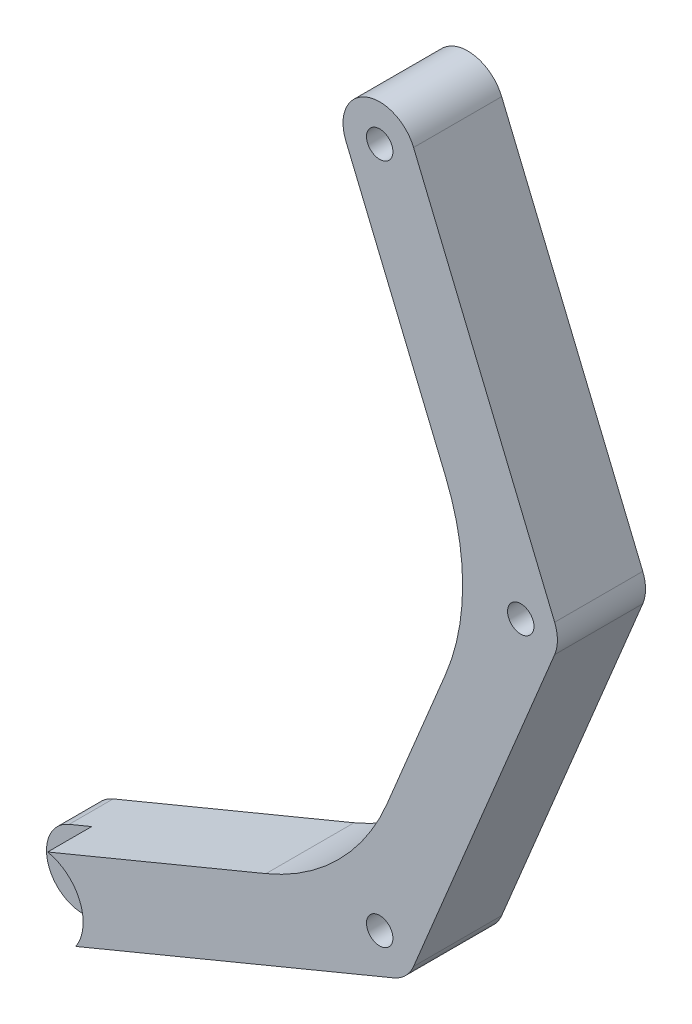
ISO-10303-21;
HEADER;
FILE_DESCRIPTION(('STEP AP214'),'2;1');
FILE_NAME('part.step','',(''),(''),'','','');
FILE_SCHEMA(('AUTOMOTIVE_DESIGN { 1 0 10303 214 1 1 1 1 }'));
ENDSEC;
DATA;
#1=APPLICATION_CONTEXT('core data for automotive mechanical design processes');
#2=APPLICATION_PROTOCOL_DEFINITION('international standard','automotive_design',2000,#1);
#3=PRODUCT_CONTEXT('',#1,'mechanical');
#4=PRODUCT('Part','Part','',(#3));
#5=PRODUCT_RELATED_PRODUCT_CATEGORY('part','',(#4));
#6=PRODUCT_DEFINITION_FORMATION('','',#4);
#7=PRODUCT_DEFINITION_CONTEXT('part definition',#1,'design');
#8=PRODUCT_DEFINITION('design','',#6,#7);
#9=PRODUCT_DEFINITION_SHAPE('','',#8);
#10=(LENGTH_UNIT() NAMED_UNIT(*) SI_UNIT(.MILLI.,.METRE.));
#11=(NAMED_UNIT(*) PLANE_ANGLE_UNIT() SI_UNIT($,.RADIAN.));
#12=(NAMED_UNIT(*) SI_UNIT($,.STERADIAN.) SOLID_ANGLE_UNIT());
#13=UNCERTAINTY_MEASURE_WITH_UNIT(LENGTH_MEASURE(1.E-05),#10,'distance_accuracy_value','');
#14=(GEOMETRIC_REPRESENTATION_CONTEXT(3) GLOBAL_UNCERTAINTY_ASSIGNED_CONTEXT((#13)) GLOBAL_UNIT_ASSIGNED_CONTEXT((#10,
#11,#12)) REPRESENTATION_CONTEXT('',''));
#15=CARTESIAN_POINT('',(0.,0.,0.));
#16=DIRECTION('',(0.,0.,1.));
#17=DIRECTION('',(1.,0.,0.));
#18=AXIS2_PLACEMENT_3D('',#15,#16,#17);
#19=CARTESIAN_POINT('',(3.17670914462147E-13,-27.3304030573829,5.));
#20=DIRECTION('',(0.,0.,-1.));
#21=DIRECTION('',(-1.,0.,0.));
#22=AXIS2_PLACEMENT_3D('',#19,#20,#21);
#23=CYLINDRICAL_SURFACE('',#22,2.08040305738294);
#24=CARTESIAN_POINT('',(3.17670914462147E-13,-27.3304030573829,2.5));
#25=DIRECTION('',(0.,0.,1.));
#26=DIRECTION('',(1.,0.,0.));
#27=AXIS2_PLACEMENT_3D('',#24,#25,#26);
#28=CIRCLE('',#27,2.08040305738294);
#29=CARTESIAN_POINT('',(-0.796135782701835,-25.4083612532929,2.5));
#30=VERTEX_POINT('',#29);
#31=CARTESIAN_POINT('',(0.796135782702469,-29.2524448614729,2.5));
#32=VERTEX_POINT('',#31);
#33=EDGE_CURVE('E285',#30,#32,#28,.T.);
#34=ORIENTED_EDGE('',*,*,#33,.F.);
#35=DIRECTION('',(0.,0.,-1.));
#36=VECTOR('',#35,1.);
#37=CARTESIAN_POINT('',(-0.796135782701835,-25.4083612532929,5.));
#38=LINE('',#37,#36);
#39=CARTESIAN_POINT('',(-0.796135782701835,-25.4083612532929,0.));
#40=VERTEX_POINT('',#39);
#41=EDGE_CURVE('E216',#30,#40,#38,.T.);
#42=ORIENTED_EDGE('',*,*,#41,.T.);
#43=CARTESIAN_POINT('',(3.17670914462147E-13,-27.3304030573829,0.));
#44=DIRECTION('',(0.,0.,1.));
#45=DIRECTION('',(1.,0.,0.));
#46=AXIS2_PLACEMENT_3D('',#43,#44,#45);
#47=CIRCLE('',#46,2.08040305738294);
#48=CARTESIAN_POINT('',(0.796135782702469,-29.2524448614729,0.));
#49=VERTEX_POINT('',#48);
#50=EDGE_CURVE('E198',#40,#49,#47,.T.);
#51=ORIENTED_EDGE('',*,*,#50,.T.);
#52=DIRECTION('',(0.,0.,-1.));
#53=VECTOR('',#52,1.);
#54=CARTESIAN_POINT('',(0.796135782702469,-29.2524448614729,5.));
#55=LINE('',#54,#53);
#56=EDGE_CURVE('E160',#32,#49,#55,.T.);
#57=ORIENTED_EDGE('',*,*,#56,.F.);
#58=EDGE_LOOP('',(#34,#42,#51,#57));
#59=FACE_BOUND('',#58,.T.);
#60=ADVANCED_FACE('F39',(#59),#23,.T.);
#61=CARTESIAN_POINT('',(27.3304030573829,3.15265643167592E-13,5.));
#62=DIRECTION('',(0.,0.,-1.));
#63=DIRECTION('',(-1.,0.,0.));
#64=AXIS2_PLACEMENT_3D('',#61,#62,#63);
#65=CYLINDRICAL_SURFACE('',#64,2.08040305738295);
#66=CARTESIAN_POINT('',(27.3304030573829,3.15265643167592E-13,0.));
#67=DIRECTION('',(0.,0.,1.));
#68=DIRECTION('',(1.,0.,0.));
#69=AXIS2_PLACEMENT_3D('',#66,#67,#68);
#70=CIRCLE('',#69,2.08040305738295);
#71=CARTESIAN_POINT('',(29.252444861473,-0.796135782701798,0.));
#72=VERTEX_POINT('',#71);
#73=CARTESIAN_POINT('',(29.2524448614729,0.796135782702469,0.));
#74=VERTEX_POINT('',#73);
#75=EDGE_CURVE('E171',#72,#74,#70,.T.);
#76=ORIENTED_EDGE('',*,*,#75,.T.);
#77=DIRECTION('',(0.,0.,-1.));
#78=VECTOR('',#77,1.);
#79=CARTESIAN_POINT('',(29.2524448614729,0.796135782702469,5.));
#80=LINE('',#79,#78);
#81=CARTESIAN_POINT('',(29.2524448614729,0.796135782702469,5.));
#82=VERTEX_POINT('',#81);
#83=EDGE_CURVE('E243',#82,#74,#80,.T.);
#84=ORIENTED_EDGE('',*,*,#83,.F.);
#85=CARTESIAN_POINT('',(27.3304030573829,3.15265643167592E-13,5.));
#86=DIRECTION('',(0.,0.,1.));
#87=DIRECTION('',(1.,0.,0.));
#88=AXIS2_PLACEMENT_3D('',#85,#86,#87);
#89=CIRCLE('',#88,2.08040305738295);
#90=CARTESIAN_POINT('',(29.252444861473,-0.796135782701798,5.));
#91=VERTEX_POINT('',#90);
#92=EDGE_CURVE('E209',#91,#82,#89,.T.);
#93=ORIENTED_EDGE('',*,*,#92,.F.);
#94=DIRECTION('',(0.,0.,-1.));
#95=VECTOR('',#94,1.);
#96=CARTESIAN_POINT('',(29.252444861473,-0.796135782701798,5.));
#97=LINE('',#96,#95);
#98=EDGE_CURVE('E167',#91,#72,#97,.T.);
#99=ORIENTED_EDGE('',*,*,#98,.T.);
#100=EDGE_LOOP('',(#76,#84,#93,#99));
#101=FACE_BOUND('',#100,.T.);
#102=ADVANCED_FACE('F41',(#101),#65,.T.);
#103=CARTESIAN_POINT('',(21.2475551385268,20.1216491171394,5.));
#104=DIRECTION('',(-0.923879532511282,-0.382683432365101,0.));
#105=DIRECTION('',(0.382683432365101,-0.923879532511282,0.));
#106=AXIS2_PLACEMENT_3D('',#103,#104,#105);
#107=PLANE('',#106);
#108=DIRECTION('',(-0.382683432365101,0.923879532511282,0.));
#109=VECTOR('',#108,1.);
#110=CARTESIAN_POINT('',(21.2475551385268,20.1216491171394,0.));
#111=LINE('',#110,#109);
#112=CARTESIAN_POINT('',(21.2475551385268,20.1216491171394,0.));
#113=VERTEX_POINT('',#112);
#114=EDGE_CURVE('E175',#74,#113,#111,.T.);
#115=ORIENTED_EDGE('',*,*,#114,.T.);
#116=DIRECTION('',(0.,0.,-1.));
#117=VECTOR('',#116,1.);
#118=CARTESIAN_POINT('',(21.2475551385268,20.1216491171394,5.));
#119=LINE('',#118,#117);
#120=CARTESIAN_POINT('',(21.2475551385268,20.1216491171394,5.));
#121=VERTEX_POINT('',#120);
#122=EDGE_CURVE('E239',#121,#113,#119,.T.);
#123=ORIENTED_EDGE('',*,*,#122,.F.);
#124=DIRECTION('',(-0.382683432365101,0.923879532511282,0.));
#125=VECTOR('',#124,1.);
#126=CARTESIAN_POINT('',(21.2475551385268,20.1216491171394,5.));
#127=LINE('',#126,#125);
#128=EDGE_CURVE('E120',#82,#121,#127,.T.);
#129=ORIENTED_EDGE('',*,*,#128,.F.);
#130=ORIENTED_EDGE('',*,*,#83,.T.);
#131=EDGE_LOOP('',(#115,#123,#129,#130));
#132=FACE_BOUND('',#131,.T.);
#133=ADVANCED_FACE('F344',(#132),#107,.F.);
#134=CARTESIAN_POINT('',(19.3255133344368,19.3255133344373,5.));
#135=DIRECTION('',(0.,0.,-1.));
#136=DIRECTION('',(-1.,0.,0.));
#137=AXIS2_PLACEMENT_3D('',#134,#135,#136);
#138=CYLINDRICAL_SURFACE('',#137,2.08040305738294);
#139=CARTESIAN_POINT('',(19.3255133344368,19.3255133344373,0.));
#140=DIRECTION('',(0.,0.,1.));
#141=DIRECTION('',(1.,0.,0.));
#142=AXIS2_PLACEMENT_3D('',#139,#140,#141);
#143=CIRCLE('',#142,2.08040305738294);
#144=CARTESIAN_POINT('',(17.4034715303468,18.5293775517351,0.));
#145=VERTEX_POINT('',#144);
#146=EDGE_CURVE('E179',#113,#145,#143,.T.);
#147=ORIENTED_EDGE('',*,*,#146,.T.);
#148=DIRECTION('',(0.,0.,-1.));
#149=VECTOR('',#148,1.);
#150=CARTESIAN_POINT('',(17.4034715303468,18.5293775517351,5.));
#151=LINE('',#150,#149);
#152=CARTESIAN_POINT('',(17.4034715303468,18.5293775517351,5.));
#153=VERTEX_POINT('',#152);
#154=EDGE_CURVE('E235',#153,#145,#151,.T.);
#155=ORIENTED_EDGE('',*,*,#154,.F.);
#156=CARTESIAN_POINT('',(19.3255133344368,19.3255133344373,5.));
#157=DIRECTION('',(0.,0.,1.));
#158=DIRECTION('',(1.,0.,0.));
#159=AXIS2_PLACEMENT_3D('',#156,#157,#158);
#160=CIRCLE('',#159,2.08040305738294);
#161=EDGE_CURVE('E296',#121,#153,#160,.T.);
#162=ORIENTED_EDGE('',*,*,#161,.F.);
#163=ORIENTED_EDGE('',*,*,#122,.T.);
#164=EDGE_LOOP('',(#147,#155,#162,#163));
#165=FACE_BOUND('',#164,.T.);
#166=ADVANCED_FACE('F347',(#165),#138,.T.);
#167=CARTESIAN_POINT('',(17.4034715303468,18.5293775517351,5.));
#168=DIRECTION('',(0.923879532511282,0.382683432365101,0.));
#169=DIRECTION('',(-0.382683432365101,0.923879532511282,0.));
#170=AXIS2_PLACEMENT_3D('',#167,#168,#169);
#171=PLANE('',#170);
#172=DIRECTION('',(0.382683432365101,-0.923879532511282,0.));
#173=VECTOR('',#172,1.);
#174=CARTESIAN_POINT('',(17.4034715303468,18.5293775517351,0.));
#175=LINE('',#174,#173);
#176=CARTESIAN_POINT('',(23.0654801337871,4.86007959103696,0.));
#177=VERTEX_POINT('',#176);
#178=EDGE_CURVE('E182',#145,#177,#175,.T.);
#179=ORIENTED_EDGE('',*,*,#178,.T.);
#180=DIRECTION('',(0.,0.,-1.));
#181=VECTOR('',#180,1.);
#182=CARTESIAN_POINT('',(23.0654801337871,4.86007959103696,5.));
#183=LINE('',#182,#181);
#184=CARTESIAN_POINT('',(23.0654801337871,4.86007959103696,5.));
#185=VERTEX_POINT('',#184);
#186=EDGE_CURVE('E231',#185,#177,#183,.T.);
#187=ORIENTED_EDGE('',*,*,#186,.F.);
#188=DIRECTION('',(0.382683432365101,-0.923879532511282,0.));
#189=VECTOR('',#188,1.);
#190=CARTESIAN_POINT('',(17.4034715303468,18.5293775517351,5.));
#191=LINE('',#190,#189);
#192=EDGE_CURVE('E299',#153,#185,#191,.T.);
#193=ORIENTED_EDGE('',*,*,#192,.F.);
#194=ORIENTED_EDGE('',*,*,#154,.T.);
#195=EDGE_LOOP('',(#179,#187,#193,#194));
#196=FACE_BOUND('',#195,.T.);
#197=ADVANCED_FACE('F352',(#196),#171,.F.);
#198=CARTESIAN_POINT('',(11.3322100708938,1.31912150161832E-13,5.));
#199=DIRECTION('',(0.,0.,-1.));
#200=DIRECTION('',(-1.,0.,0.));
#201=AXIS2_PLACEMENT_3D('',#198,#199,#200);
#202=CYLINDRICAL_SURFACE('',#201,12.7);
#203=CARTESIAN_POINT('',(11.3322100708938,1.31912150161832E-13,0.));
#204=DIRECTION('',(0.,0.,-1.));
#205=DIRECTION('',(-1.,0.,0.));
#206=AXIS2_PLACEMENT_3D('',#203,#204,#205);
#207=CIRCLE('',#206,12.7);
#208=CARTESIAN_POINT('',(23.0654801337872,-4.86007959103642,0.));
#209=VERTEX_POINT('',#208);
#210=EDGE_CURVE('E185',#177,#209,#207,.T.);
#211=ORIENTED_EDGE('',*,*,#210,.T.);
#212=DIRECTION('',(0.,0.,-1.));
#213=VECTOR('',#212,1.);
#214=CARTESIAN_POINT('',(23.0654801337872,-4.86007959103642,5.));
#215=LINE('',#214,#213);
#216=CARTESIAN_POINT('',(23.0654801337872,-4.86007959103642,5.));
#217=VERTEX_POINT('',#216);
#218=EDGE_CURVE('E227',#217,#209,#215,.T.);
#219=ORIENTED_EDGE('',*,*,#218,.F.);
#220=CARTESIAN_POINT('',(11.3322100708938,1.31912150161832E-13,5.));
#221=DIRECTION('',(0.,0.,-1.));
#222=DIRECTION('',(-1.,0.,0.));
#223=AXIS2_PLACEMENT_3D('',#220,#221,#222);
#224=CIRCLE('',#223,12.7);
#225=EDGE_CURVE('E302',#185,#217,#224,.T.);
#226=ORIENTED_EDGE('',*,*,#225,.F.);
#227=ORIENTED_EDGE('',*,*,#186,.T.);
#228=EDGE_LOOP('',(#211,#219,#226,#227));
#229=FACE_BOUND('',#228,.T.);
#230=ADVANCED_FACE('F358',(#229),#202,.F.);
#231=CARTESIAN_POINT('',(23.0654801337872,-4.86007959103642,5.));
#232=DIRECTION('',(0.923879532511291,-0.382683432365079,0.));
#233=DIRECTION('',(0.382683432365079,0.923879532511291,0.));
#234=AXIS2_PLACEMENT_3D('',#231,#232,#233);
#235=PLANE('',#234);
#236=DIRECTION('',(-0.382683432365079,-0.923879532511291,0.));
#237=VECTOR('',#236,1.);
#238=CARTESIAN_POINT('',(23.0654801337872,-4.86007959103642,0.));
#239=LINE('',#238,#237);
#240=CARTESIAN_POINT('',(19.746352649853,-12.8731621779959,0.));
#241=VERTEX_POINT('',#240);
#242=EDGE_CURVE('E188',#209,#241,#239,.T.);
#243=ORIENTED_EDGE('',*,*,#242,.T.);
#244=DIRECTION('',(0.,0.,-1.));
#245=VECTOR('',#244,1.);
#246=CARTESIAN_POINT('',(19.746352649853,-12.8731621779959,5.));
#247=LINE('',#246,#245);
#248=CARTESIAN_POINT('',(19.746352649853,-12.8731621779959,5.));
#249=VERTEX_POINT('',#248);
#250=EDGE_CURVE('E223',#249,#241,#247,.T.);
#251=ORIENTED_EDGE('',*,*,#250,.F.);
#252=DIRECTION('',(-0.382683432365079,-0.923879532511291,0.));
#253=VECTOR('',#252,1.);
#254=CARTESIAN_POINT('',(23.0654801337872,-4.86007959103642,5.));
#255=LINE('',#254,#253);
#256=EDGE_CURVE('E305',#217,#249,#255,.T.);
#257=ORIENTED_EDGE('',*,*,#256,.F.);
#258=ORIENTED_EDGE('',*,*,#218,.T.);
#259=EDGE_LOOP('',(#243,#251,#257,#258));
#260=FACE_BOUND('',#259,.T.);
#261=ADVANCED_FACE('F362',(#260),#235,.F.);
#262=CARTESIAN_POINT('',(8.01308258695958,-8.0130825869594,5.));
#263=DIRECTION('',(0.,0.,-1.));
#264=DIRECTION('',(-1.,0.,0.));
#265=AXIS2_PLACEMENT_3D('',#262,#263,#264);
#266=CYLINDRICAL_SURFACE('',#265,12.7);
#267=CARTESIAN_POINT('',(8.01308258695958,-8.0130825869594,0.));
#268=DIRECTION('',(0.,0.,-1.));
#269=DIRECTION('',(1.,0.,0.));
#270=AXIS2_PLACEMENT_3D('',#267,#268,#269);
#271=CIRCLE('',#270,12.7);
#272=CARTESIAN_POINT('',(12.8731621779963,-19.7463526498527,0.));
#273=VERTEX_POINT('',#272);
#274=EDGE_CURVE('E191',#241,#273,#271,.T.);
#275=ORIENTED_EDGE('',*,*,#274,.T.);
#276=DIRECTION('',(0.,0.,-1.));
#277=VECTOR('',#276,1.);
#278=CARTESIAN_POINT('',(12.8731621779963,-19.7463526498527,5.));
#279=LINE('',#278,#277);
#280=CARTESIAN_POINT('',(12.8731621779963,-19.7463526498527,5.));
#281=VERTEX_POINT('',#280);
#282=EDGE_CURVE('E219',#281,#273,#279,.T.);
#283=ORIENTED_EDGE('',*,*,#282,.F.);
#284=CARTESIAN_POINT('',(8.01308258695958,-8.0130825869594,5.));
#285=DIRECTION('',(0.,0.,-1.));
#286=DIRECTION('',(1.,0.,0.));
#287=AXIS2_PLACEMENT_3D('',#284,#285,#286);
#288=CIRCLE('',#287,12.7);
#289=EDGE_CURVE('E308',#249,#281,#288,.T.);
#290=ORIENTED_EDGE('',*,*,#289,.F.);
#291=ORIENTED_EDGE('',*,*,#250,.T.);
#292=EDGE_LOOP('',(#275,#283,#290,#291));
#293=FACE_BOUND('',#292,.T.);
#294=ADVANCED_FACE('F365',(#293),#266,.F.);
#295=CARTESIAN_POINT('',(-0.796135782701835,-25.4083612532929,5.));
#296=DIRECTION('',(0.3826834323651,-0.923879532511283,0.));
#297=DIRECTION('',(0.923879532511283,0.3826834323651,0.));
#298=AXIS2_PLACEMENT_3D('',#295,#296,#297);
#299=PLANE('',#298);
#300=DIRECTION('',(-0.923879532511283,-0.3826834323651,0.));
#301=VECTOR('',#300,1.);
#302=CARTESIAN_POINT('',(-0.796135782701835,-25.4083612532929,2.5));
#303=LINE('',#302,#301);
#304=CARTESIAN_POINT('',(0.484670211404371,-24.8778340397654,2.5));
#305=VERTEX_POINT('',#304);
#306=EDGE_CURVE('E176',#305,#30,#303,.T.);
#307=ORIENTED_EDGE('',*,*,#306,.F.);
#308=DIRECTION('',(0.,0.,1.));
#309=VECTOR('',#308,1.);
#310=CARTESIAN_POINT('',(0.484670211404372,-24.8778340397654,2.5));
#311=LINE('',#310,#309);
#312=CARTESIAN_POINT('',(0.484670211404371,-24.8778340397654,5.));
#313=VERTEX_POINT('',#312);
#314=EDGE_CURVE('E281',#305,#313,#311,.T.);
#315=ORIENTED_EDGE('',*,*,#314,.T.);
#316=DIRECTION('',(-0.923879532511282,-0.3826834323651,0.));
#317=VECTOR('',#316,1.);
#318=CARTESIAN_POINT('',(-0.796135782701835,-25.4083612532929,5.));
#319=LINE('',#318,#317);
#320=EDGE_CURVE('E150',#281,#313,#319,.T.);
#321=ORIENTED_EDGE('',*,*,#320,.F.);
#322=ORIENTED_EDGE('',*,*,#282,.T.);
#323=DIRECTION('',(-0.923879532511282,-0.3826834323651,0.));
#324=VECTOR('',#323,1.);
#325=CARTESIAN_POINT('',(-0.796135782701835,-25.4083612532929,0.));
#326=LINE('',#325,#324);
#327=EDGE_CURVE('E194',#273,#40,#326,.T.);
#328=ORIENTED_EDGE('',*,*,#327,.T.);
#329=ORIENTED_EDGE('',*,*,#41,.F.);
#330=EDGE_LOOP('',(#307,#315,#321,#322,#328,#329));
#331=FACE_BOUND('',#330,.T.);
#332=ADVANCED_FACE('F320',(#331),#299,.F.);
#333=CARTESIAN_POINT('',(0.796135782702469,-29.2524448614729,5.));
#334=DIRECTION('',(-0.3826834323651,0.923879532511283,0.));
#335=DIRECTION('',(-0.923879532511283,-0.3826834323651,0.));
#336=AXIS2_PLACEMENT_3D('',#333,#334,#335);
#337=PLANE('',#336);
#338=DIRECTION('',(0.923879532511283,0.3826834323651,0.));
#339=VECTOR('',#338,1.);
#340=CARTESIAN_POINT('',(0.796135782702469,-29.2524448614729,5.));
#341=LINE('',#340,#339);
#342=CARTESIAN_POINT('',(2.07694177680868,-28.7219176479454,5.));
#343=VERTEX_POINT('',#342);
#344=CARTESIAN_POINT('',(20.1216491171394,-21.2475551385268,5.));
#345=VERTEX_POINT('',#344);
#346=EDGE_CURVE('E141',#343,#345,#341,.T.);
#347=ORIENTED_EDGE('',*,*,#346,.F.);
#348=DIRECTION('',(0.,0.,1.));
#349=VECTOR('',#348,1.);
#350=CARTESIAN_POINT('',(2.07694177680868,-28.7219176479454,2.5));
#351=LINE('',#350,#349);
#352=CARTESIAN_POINT('',(2.07694177680868,-28.7219176479454,2.5));
#353=VERTEX_POINT('',#352);
#354=EDGE_CURVE('E57',#343,#353,#351,.F.);
#355=ORIENTED_EDGE('',*,*,#354,.T.);
#356=DIRECTION('',(0.923879532511283,0.3826834323651,0.));
#357=VECTOR('',#356,1.);
#358=CARTESIAN_POINT('',(0.796135782702469,-29.2524448614729,2.5));
#359=LINE('',#358,#357);
#360=EDGE_CURVE('E11',#32,#353,#359,.T.);
#361=ORIENTED_EDGE('',*,*,#360,.F.);
#362=ORIENTED_EDGE('',*,*,#56,.T.);
#363=DIRECTION('',(0.923879532511283,0.3826834323651,0.));
#364=VECTOR('',#363,1.);
#365=CARTESIAN_POINT('',(0.796135782702469,-29.2524448614729,0.));
#366=LINE('',#365,#364);
#367=CARTESIAN_POINT('',(20.1216491171394,-21.2475551385268,0.));
#368=VERTEX_POINT('',#367);
#369=EDGE_CURVE('E156',#49,#368,#366,.T.);
#370=ORIENTED_EDGE('',*,*,#369,.T.);
#371=DIRECTION('',(0.,0.,-1.));
#372=VECTOR('',#371,1.);
#373=CARTESIAN_POINT('',(20.1216491171394,-21.2475551385268,5.));
#374=LINE('',#373,#372);
#375=EDGE_CURVE('E153',#345,#368,#374,.T.);
#376=ORIENTED_EDGE('',*,*,#375,.F.);
#377=EDGE_LOOP('',(#347,#355,#361,#362,#370,#376));
#378=FACE_BOUND('',#377,.T.);
#379=ADVANCED_FACE('F154',(#378),#337,.F.);
#380=CARTESIAN_POINT('',(19.3255133344373,-19.3255133344368,5.));
#381=DIRECTION('',(0.,0.,-1.));
#382=DIRECTION('',(-1.,0.,0.));
#383=AXIS2_PLACEMENT_3D('',#380,#381,#382);
#384=CYLINDRICAL_SURFACE('',#383,2.08040305738295);
#385=CARTESIAN_POINT('',(19.3255133344373,-19.3255133344368,0.));
#386=DIRECTION('',(0.,0.,1.));
#387=DIRECTION('',(1.,0.,0.));
#388=AXIS2_PLACEMENT_3D('',#385,#386,#387);
#389=CIRCLE('',#388,2.08040305738295);
#390=CARTESIAN_POINT('',(21.2475551385273,-20.1216491171389,0.));
#391=VERTEX_POINT('',#390);
#392=EDGE_CURVE('E204',#368,#391,#389,.T.);
#393=ORIENTED_EDGE('',*,*,#392,.T.);
#394=DIRECTION('',(0.,0.,-1.));
#395=VECTOR('',#394,1.);
#396=CARTESIAN_POINT('',(21.2475551385273,-20.1216491171389,5.));
#397=LINE('',#396,#395);
#398=CARTESIAN_POINT('',(21.2475551385273,-20.1216491171389,5.));
#399=VERTEX_POINT('',#398);
#400=EDGE_CURVE('E161',#399,#391,#397,.T.);
#401=ORIENTED_EDGE('',*,*,#400,.F.);
#402=CARTESIAN_POINT('',(19.3255133344373,-19.3255133344368,5.));
#403=DIRECTION('',(0.,0.,1.));
#404=DIRECTION('',(1.,0.,0.));
#405=AXIS2_PLACEMENT_3D('',#402,#403,#404);
#406=CIRCLE('',#405,2.08040305738295);
#407=EDGE_CURVE('E145',#345,#399,#406,.T.);
#408=ORIENTED_EDGE('',*,*,#407,.F.);
#409=ORIENTED_EDGE('',*,*,#375,.T.);
#410=EDGE_LOOP('',(#393,#401,#408,#409));
#411=FACE_BOUND('',#410,.T.);
#412=ADVANCED_FACE('F163',(#411),#384,.T.);
#413=CARTESIAN_POINT('',(29.252444861473,-0.796135782701798,5.));
#414=DIRECTION('',(-0.923879532511291,0.382683432365079,0.));
#415=DIRECTION('',(-0.382683432365079,-0.923879532511291,0.));
#416=AXIS2_PLACEMENT_3D('',#413,#414,#415);
#417=PLANE('',#416);
#418=DIRECTION('',(0.382683432365079,0.923879532511291,0.));
#419=VECTOR('',#418,1.);
#420=CARTESIAN_POINT('',(29.252444861473,-0.796135782701798,0.));
#421=LINE('',#420,#419);
#422=EDGE_CURVE('E111',#391,#72,#421,.T.);
#423=ORIENTED_EDGE('',*,*,#422,.T.);
#424=ORIENTED_EDGE('',*,*,#98,.F.);
#425=DIRECTION('',(0.382683432365079,0.923879532511291,0.));
#426=VECTOR('',#425,1.);
#427=CARTESIAN_POINT('',(29.252444861473,-0.796135782701798,5.));
#428=LINE('',#427,#426);
#429=EDGE_CURVE('E66',#399,#91,#428,.T.);
#430=ORIENTED_EDGE('',*,*,#429,.F.);
#431=ORIENTED_EDGE('',*,*,#400,.T.);
#432=EDGE_LOOP('',(#423,#424,#430,#431));
#433=FACE_BOUND('',#432,.T.);
#434=ADVANCED_FACE('F338',(#433),#417,.F.);
#435=CARTESIAN_POINT('',(27.3304030573829,3.15265643167592E-13,5.));
#436=DIRECTION('',(0.,0.,1.));
#437=DIRECTION('',(1.,0.,0.));
#438=AXIS2_PLACEMENT_3D('',#435,#436,#437);
#439=PLANE('',#438);
#440=CARTESIAN_POINT('',(19.3255133344368,19.3255133344373,5.));
#441=DIRECTION('',(0.,0.,-1.));
#442=DIRECTION('',(-1.,0.,0.));
#443=AXIS2_PLACEMENT_3D('',#440,#441,#442);
#444=CIRCLE('',#443,0.750000000000002);
#445=CARTESIAN_POINT('',(18.5755133344368,19.3255133344373,5.));
#446=VERTEX_POINT('',#445);
#447=EDGE_CURVE('E258',#446,#446,#444,.T.);
#448=ORIENTED_EDGE('',*,*,#447,.T.);
#449=EDGE_LOOP('',(#448));
#450=FACE_BOUND('',#449,.T.);
#451=CARTESIAN_POINT('',(27.3304030573829,3.15265643167592E-13,5.));
#452=DIRECTION('',(0.,0.,-1.));
#453=DIRECTION('',(-1.,0.,0.));
#454=AXIS2_PLACEMENT_3D('',#451,#452,#453);
#455=CIRCLE('',#454,0.750000000000002);
#456=CARTESIAN_POINT('',(26.5804030573829,3.15265643167592E-13,5.));
#457=VERTEX_POINT('',#456);
#458=EDGE_CURVE('E417',#457,#457,#455,.T.);
#459=ORIENTED_EDGE('',*,*,#458,.T.);
#460=EDGE_LOOP('',(#459));
#461=FACE_BOUND('',#460,.T.);
#462=CARTESIAN_POINT('',(19.3255133344373,-19.3255133344368,5.));
#463=DIRECTION('',(0.,0.,-1.));
#464=DIRECTION('',(-1.,0.,0.));
#465=AXIS2_PLACEMENT_3D('',#462,#463,#464);
#466=CIRCLE('',#465,0.750000000000002);
#467=CARTESIAN_POINT('',(18.5755133344373,-19.3255133344368,5.));
#468=VERTEX_POINT('',#467);
#469=EDGE_CURVE('E274',#468,#468,#466,.T.);
#470=ORIENTED_EDGE('',*,*,#469,.T.);
#471=EDGE_LOOP('',(#470));
#472=FACE_BOUND('',#471,.T.);
#473=CARTESIAN_POINT('',(3.17670914462147E-13,-27.3304030573829,5.));
#474=DIRECTION('',(0.,0.,1.));
#475=DIRECTION('',(1.,0.,0.));
#476=AXIS2_PLACEMENT_3D('',#473,#474,#475);
#477=CIRCLE('',#476,2.5);
#478=EDGE_CURVE('E49',#343,#313,#477,.T.);
#479=ORIENTED_EDGE('',*,*,#478,.F.);
#480=ORIENTED_EDGE('',*,*,#346,.T.);
#481=ORIENTED_EDGE('',*,*,#407,.T.);
#482=ORIENTED_EDGE('',*,*,#429,.T.);
#483=ORIENTED_EDGE('',*,*,#92,.T.);
#484=ORIENTED_EDGE('',*,*,#128,.T.);
#485=ORIENTED_EDGE('',*,*,#161,.T.);
#486=ORIENTED_EDGE('',*,*,#192,.T.);
#487=ORIENTED_EDGE('',*,*,#225,.T.);
#488=ORIENTED_EDGE('',*,*,#256,.T.);
#489=ORIENTED_EDGE('',*,*,#289,.T.);
#490=ORIENTED_EDGE('',*,*,#320,.T.);
#491=EDGE_LOOP('',(#479,#480,#481,#482,#483,#484,#485,#486,#487,#488,#489,#490));
#492=FACE_BOUND('',#491,.T.);
#493=ADVANCED_FACE('F143',(#450,#461,#472,#492),#439,.T.);
#494=CARTESIAN_POINT('',(27.3304030573829,3.15265643167592E-13,0.));
#495=DIRECTION('',(0.,0.,1.));
#496=DIRECTION('',(1.,0.,0.));
#497=AXIS2_PLACEMENT_3D('',#494,#495,#496);
#498=PLANE('',#497);
#499=CARTESIAN_POINT('',(19.3255133344368,19.3255133344373,0.));
#500=DIRECTION('',(0.,0.,1.));
#501=DIRECTION('',(1.,0.,0.));
#502=AXIS2_PLACEMENT_3D('',#499,#500,#501);
#503=CIRCLE('',#502,0.750000000000002);
#504=CARTESIAN_POINT('',(20.0755133344368,19.3255133344373,0.));
#505=VERTEX_POINT('',#504);
#506=EDGE_CURVE('E43',#505,#505,#503,.T.);
#507=ORIENTED_EDGE('',*,*,#506,.T.);
#508=EDGE_LOOP('',(#507));
#509=FACE_BOUND('',#508,.T.);
#510=CARTESIAN_POINT('',(27.3304030573829,3.15265643167592E-13,0.));
#511=DIRECTION('',(0.,0.,1.));
#512=DIRECTION('',(1.,0.,0.));
#513=AXIS2_PLACEMENT_3D('',#510,#511,#512);
#514=CIRCLE('',#513,0.750000000000002);
#515=CARTESIAN_POINT('',(28.0804030573829,3.15265643167592E-13,0.));
#516=VERTEX_POINT('',#515);
#517=EDGE_CURVE('E257',#516,#516,#514,.T.);
#518=ORIENTED_EDGE('',*,*,#517,.T.);
#519=EDGE_LOOP('',(#518));
#520=FACE_BOUND('',#519,.T.);
#521=CARTESIAN_POINT('',(19.3255133344373,-19.3255133344368,0.));
#522=DIRECTION('',(0.,0.,1.));
#523=DIRECTION('',(1.,0.,0.));
#524=AXIS2_PLACEMENT_3D('',#521,#522,#523);
#525=CIRCLE('',#524,0.750000000000002);
#526=CARTESIAN_POINT('',(20.0755133344373,-19.3255133344368,0.));
#527=VERTEX_POINT('',#526);
#528=EDGE_CURVE('E254',#527,#527,#525,.T.);
#529=ORIENTED_EDGE('',*,*,#528,.T.);
#530=EDGE_LOOP('',(#529));
#531=FACE_BOUND('',#530,.T.);
#532=CARTESIAN_POINT('',(3.17670914462147E-13,-27.3304030573829,0.));
#533=DIRECTION('',(0.,0.,1.));
#534=DIRECTION('',(1.,0.,0.));
#535=AXIS2_PLACEMENT_3D('',#532,#533,#534);
#536=CIRCLE('',#535,0.75);
#537=CARTESIAN_POINT('',(0.750000000000318,-27.3304030573829,0.));
#538=VERTEX_POINT('',#537);
#539=EDGE_CURVE('E253',#538,#538,#536,.T.);
#540=ORIENTED_EDGE('',*,*,#539,.T.);
#541=EDGE_LOOP('',(#540));
#542=FACE_BOUND('',#541,.T.);
#543=ORIENTED_EDGE('',*,*,#75,.F.);
#544=ORIENTED_EDGE('',*,*,#422,.F.);
#545=ORIENTED_EDGE('',*,*,#392,.F.);
#546=ORIENTED_EDGE('',*,*,#369,.F.);
#547=ORIENTED_EDGE('',*,*,#50,.F.);
#548=ORIENTED_EDGE('',*,*,#327,.F.);
#549=ORIENTED_EDGE('',*,*,#274,.F.);
#550=ORIENTED_EDGE('',*,*,#242,.F.);
#551=ORIENTED_EDGE('',*,*,#210,.F.);
#552=ORIENTED_EDGE('',*,*,#178,.F.);
#553=ORIENTED_EDGE('',*,*,#146,.F.);
#554=ORIENTED_EDGE('',*,*,#114,.F.);
#555=EDGE_LOOP('',(#543,#544,#545,#546,#547,#548,#549,#550,#551,#552,#553,#554));
#556=FACE_BOUND('',#555,.T.);
#557=ADVANCED_FACE('F337',(#509,#520,#531,#542,#556),#498,.F.);
#558=CARTESIAN_POINT('',(3.17670914462147E-13,-27.3304030573829,2.5));
#559=DIRECTION('',(0.,0.,1.));
#560=DIRECTION('',(1.,0.,0.));
#561=AXIS2_PLACEMENT_3D('',#558,#559,#560);
#562=PLANE('',#561);
#563=CARTESIAN_POINT('',(3.17670914462147E-13,-27.3304030573829,2.5));
#564=DIRECTION('',(0.,0.,1.));
#565=DIRECTION('',(1.,0.,0.));
#566=AXIS2_PLACEMENT_3D('',#563,#564,#565);
#567=CIRCLE('',#566,0.75);
#568=CARTESIAN_POINT('',(0.750000000000318,-27.3304030573829,2.5));
#569=VERTEX_POINT('',#568);
#570=EDGE_CURVE('E248',#569,#569,#567,.T.);
#571=ORIENTED_EDGE('',*,*,#570,.F.);
#572=EDGE_LOOP('',(#571));
#573=FACE_BOUND('',#572,.T.);
#574=ORIENTED_EDGE('',*,*,#306,.T.);
#575=ORIENTED_EDGE('',*,*,#33,.T.);
#576=ORIENTED_EDGE('',*,*,#360,.T.);
#577=CARTESIAN_POINT('',(3.17670914462147E-13,-27.3304030573829,2.5));
#578=DIRECTION('',(0.,0.,1.));
#579=DIRECTION('',(1.,0.,0.));
#580=AXIS2_PLACEMENT_3D('',#577,#578,#579);
#581=CIRCLE('',#580,2.5);
#582=EDGE_CURVE('E252',#353,#305,#581,.T.);
#583=ORIENTED_EDGE('',*,*,#582,.T.);
#584=EDGE_LOOP('',(#574,#575,#576,#583));
#585=FACE_BOUND('',#584,.T.);
#586=ADVANCED_FACE('F328',(#573,#585),#562,.T.);
#587=CARTESIAN_POINT('',(3.17670914462147E-13,-27.3304030573829,2.5));
#588=DIRECTION('',(0.,0.,1.));
#589=DIRECTION('',(1.,0.,0.));
#590=AXIS2_PLACEMENT_3D('',#587,#588,#589);
#591=CYLINDRICAL_SURFACE('',#590,2.5);
#592=ORIENTED_EDGE('',*,*,#582,.F.);
#593=ORIENTED_EDGE('',*,*,#354,.F.);
#594=ORIENTED_EDGE('',*,*,#478,.T.);
#595=ORIENTED_EDGE('',*,*,#314,.F.);
#596=EDGE_LOOP('',(#592,#593,#594,#595));
#597=FACE_BOUND('',#596,.T.);
#598=ADVANCED_FACE('F325',(#597),#591,.F.);
#599=CARTESIAN_POINT('',(3.17670914462147E-13,-27.3304030573829,0.));
#600=DIRECTION('',(0.,0.,1.));
#601=DIRECTION('',(1.,0.,0.));
#602=AXIS2_PLACEMENT_3D('',#599,#600,#601);
#603=CYLINDRICAL_SURFACE('',#602,0.75);
#604=ORIENTED_EDGE('',*,*,#570,.T.);
#605=EDGE_LOOP('',(#604));
#606=FACE_BOUND('',#605,.T.);
#607=ORIENTED_EDGE('',*,*,#539,.F.);
#608=EDGE_LOOP('',(#607));
#609=FACE_BOUND('',#608,.T.);
#610=ADVANCED_FACE('F393',(#606,#609),#603,.F.);
#611=CARTESIAN_POINT('',(19.3255133344373,-19.3255133344368,5.));
#612=DIRECTION('',(0.,0.,-1.));
#613=DIRECTION('',(-1.,0.,0.));
#614=AXIS2_PLACEMENT_3D('',#611,#612,#613);
#615=CYLINDRICAL_SURFACE('',#614,0.750000000000002);
#616=ORIENTED_EDGE('',*,*,#469,.F.);
#617=EDGE_LOOP('',(#616));
#618=FACE_BOUND('',#617,.T.);
#619=ORIENTED_EDGE('',*,*,#528,.F.);
#620=EDGE_LOOP('',(#619));
#621=FACE_BOUND('',#620,.T.);
#622=ADVANCED_FACE('F399',(#618,#621),#615,.F.);
#623=CARTESIAN_POINT('',(27.3304030573829,3.15265643167592E-13,5.));
#624=DIRECTION('',(0.,0.,-1.));
#625=DIRECTION('',(-1.,0.,0.));
#626=AXIS2_PLACEMENT_3D('',#623,#624,#625);
#627=CYLINDRICAL_SURFACE('',#626,0.750000000000002);
#628=ORIENTED_EDGE('',*,*,#458,.F.);
#629=EDGE_LOOP('',(#628));
#630=FACE_BOUND('',#629,.T.);
#631=ORIENTED_EDGE('',*,*,#517,.F.);
#632=EDGE_LOOP('',(#631));
#633=FACE_BOUND('',#632,.T.);
#634=ADVANCED_FACE('F403',(#630,#633),#627,.F.);
#635=CARTESIAN_POINT('',(19.3255133344368,19.3255133344373,5.));
#636=DIRECTION('',(0.,0.,-1.));
#637=DIRECTION('',(-1.,0.,0.));
#638=AXIS2_PLACEMENT_3D('',#635,#636,#637);
#639=CYLINDRICAL_SURFACE('',#638,0.750000000000002);
#640=ORIENTED_EDGE('',*,*,#447,.F.);
#641=EDGE_LOOP('',(#640));
#642=FACE_BOUND('',#641,.T.);
#643=ORIENTED_EDGE('',*,*,#506,.F.);
#644=EDGE_LOOP('',(#643));
#645=FACE_BOUND('',#644,.T.);
#646=ADVANCED_FACE('F407',(#642,#645),#639,.F.);
#647=CLOSED_SHELL('',(#60,#102,#133,#166,#197,#230,#261,#294,#332,#379,#412,#434,#493,#557,#586,
#598,#610,#622,#634,#646));
#648=MANIFOLD_SOLID_BREP('B2',#647);
#649=ADVANCED_BREP_SHAPE_REPRESENTATION('',(#18,#648),#14);
#650=SHAPE_DEFINITION_REPRESENTATION(#9,#649);
ENDSEC;
END-ISO-10303-21;
